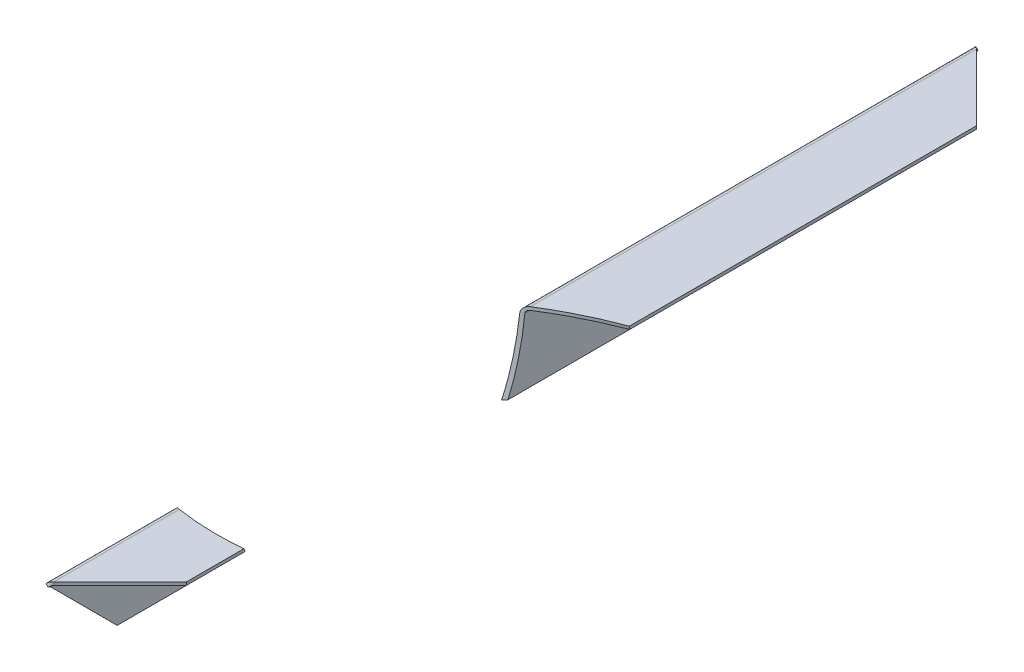
ISO-10303-21;
HEADER;
FILE_DESCRIPTION(('STEP AP214'),'2;1');
FILE_NAME('part.step','',(''),(''),'','','');
FILE_SCHEMA(('AUTOMOTIVE_DESIGN { 1 0 10303 214 1 1 1 1 }'));
ENDSEC;
DATA;
#1=APPLICATION_CONTEXT('core data for automotive mechanical design processes');
#2=APPLICATION_PROTOCOL_DEFINITION('international standard','automotive_design',2000,#1);
#3=PRODUCT_CONTEXT('',#1,'mechanical');
#4=PRODUCT('Part','Part','',(#3));
#5=PRODUCT_RELATED_PRODUCT_CATEGORY('part','',(#4));
#6=PRODUCT_DEFINITION_FORMATION('','',#4);
#7=PRODUCT_DEFINITION_CONTEXT('part definition',#1,'design');
#8=PRODUCT_DEFINITION('design','',#6,#7);
#9=PRODUCT_DEFINITION_SHAPE('','',#8);
#10=(LENGTH_UNIT() NAMED_UNIT(*) SI_UNIT(.MILLI.,.METRE.));
#11=(NAMED_UNIT(*) PLANE_ANGLE_UNIT() SI_UNIT($,.RADIAN.));
#12=(NAMED_UNIT(*) SI_UNIT($,.STERADIAN.) SOLID_ANGLE_UNIT());
#13=UNCERTAINTY_MEASURE_WITH_UNIT(LENGTH_MEASURE(1.E-05),#10,'distance_accuracy_value','');
#14=(GEOMETRIC_REPRESENTATION_CONTEXT(3) GLOBAL_UNCERTAINTY_ASSIGNED_CONTEXT((#13)) GLOBAL_UNIT_ASSIGNED_CONTEXT((#10,
#11,#12)) REPRESENTATION_CONTEXT('',''));
#15=CARTESIAN_POINT('',(0.,0.,0.));
#16=DIRECTION('',(0.,0.,1.));
#17=DIRECTION('',(1.,0.,0.));
#18=AXIS2_PLACEMENT_3D('',#15,#16,#17);
#19=CARTESIAN_POINT('',(-112.900713999999,0.188336430717542,0.));
#20=DIRECTION('',(-1.,0.,0.));
#21=DIRECTION('',(0.,0.,1.));
#22=AXIS2_PLACEMENT_3D('',#19,#20,#21);
#23=PLANE('',#22);
#24=CARTESIAN_POINT('',(-112.900714,144.464444628672,47.4402808210171));
#25=DIRECTION('',(-1.,0.,0.));
#26=DIRECTION('',(0.,0.905298236340612,0.424776533342623));
#27=AXIS2_PLACEMENT_3D('',#24,#25,#26);
#28=ELLIPSE('',#27,71.8757346714846,44.45);
#29=CARTESIAN_POINT('',(-112.900714,111.427514,-2.55808912747782));
#30=VERTEX_POINT('',#29);
#31=CARTESIAN_POINT('',(-112.900714,95.4360504307374,1.79167078233812));
#32=VERTEX_POINT('',#31);
#33=EDGE_CURVE('E12',#30,#32,#28,.T.);
#34=ORIENTED_EDGE('',*,*,#33,.F.);
#35=DIRECTION('',(0.,0.,-1.));
#36=VECTOR('',#35,1.);
#37=CARTESIAN_POINT('',(-112.900714,111.427514,0.));
#38=LINE('',#37,#36);
#39=CARTESIAN_POINT('',(-112.900714,111.427514,-111.239177569261));
#40=VERTEX_POINT('',#39);
#41=EDGE_CURVE('E192',#30,#40,#38,.T.);
#42=ORIENTED_EDGE('',*,*,#41,.T.);
#43=DIRECTION('',(0.,0.707106781186616,-0.70710678118648));
#44=VECTOR('',#43,1.);
#45=CARTESIAN_POINT('',(-112.900714,112.295300430737,-112.106963999998));
#46=LINE('',#45,#44);
#47=CARTESIAN_POINT('',(-112.900714,95.4360504307374,-95.2477140000015));
#48=VERTEX_POINT('',#47);
#49=EDGE_CURVE('E305',#48,#40,#46,.T.);
#50=ORIENTED_EDGE('',*,*,#49,.F.);
#51=DIRECTION('',(0.,0.,-1.));
#52=VECTOR('',#51,1.);
#53=CARTESIAN_POINT('',(-112.900714,95.4360504307374,95.2477140000016));
#54=LINE('',#53,#52);
#55=EDGE_CURVE('E321',#32,#48,#54,.T.);
#56=ORIENTED_EDGE('',*,*,#55,.F.);
#57=EDGE_LOOP('',(#34,#42,#50,#56));
#58=FACE_BOUND('',#57,.T.);
#59=ADVANCED_FACE('F42',(#58),#23,.T.);
#60=CARTESIAN_POINT('',(-112.164113999999,0.188336430717542,0.));
#61=DIRECTION('',(-1.,0.,0.));
#62=DIRECTION('',(0.,0.,1.));
#63=AXIS2_PLACEMENT_3D('',#60,#61,#62);
#64=PLANE('',#63);
#65=DIRECTION('',(0.,0.,-1.));
#66=VECTOR('',#65,1.);
#67=CARTESIAN_POINT('',(-112.164114,111.427514,0.));
#68=LINE('',#67,#66);
#69=CARTESIAN_POINT('',(-112.164114,111.427514,-3.05309485837146));
#70=VERTEX_POINT('',#69);
#71=CARTESIAN_POINT('',(-112.164114,111.427514,-111.239177569261));
#72=VERTEX_POINT('',#71);
#73=EDGE_CURVE('E142',#70,#72,#68,.T.);
#74=ORIENTED_EDGE('',*,*,#73,.F.);
#75=CARTESIAN_POINT('',(-112.164114,143.617083259913,47.0426889443722));
#76=DIRECTION('',(-1.,0.,0.));
#77=DIRECTION('',(0.,0.905298236340612,0.424776533342623));
#78=AXIS2_PLACEMENT_3D('',#75,#76,#77);
#79=ELLIPSE('',#78,71.8757346714846,44.45);
#80=CARTESIAN_POINT('',(-112.164114,95.4360504307374,1.01322374201379));
#81=VERTEX_POINT('',#80);
#82=EDGE_CURVE('E62',#70,#81,#79,.T.);
#83=ORIENTED_EDGE('',*,*,#82,.T.);
#84=DIRECTION('',(0.,0.,-1.));
#85=VECTOR('',#84,1.);
#86=CARTESIAN_POINT('',(-112.164114,95.4360504307374,95.2477140000016));
#87=LINE('',#86,#85);
#88=CARTESIAN_POINT('',(-112.164114,95.4360504307374,-95.2477140000015));
#89=VERTEX_POINT('',#88);
#90=EDGE_CURVE('E310',#81,#89,#87,.T.);
#91=ORIENTED_EDGE('',*,*,#90,.T.);
#92=DIRECTION('',(0.,0.707106781186616,-0.70710678118648));
#93=VECTOR('',#92,1.);
#94=CARTESIAN_POINT('',(-112.164114,112.295300430737,-112.106963999998));
#95=LINE('',#94,#93);
#96=EDGE_CURVE('E303',#89,#72,#95,.T.);
#97=ORIENTED_EDGE('',*,*,#96,.T.);
#98=EDGE_LOOP('',(#74,#83,#91,#97));
#99=FACE_BOUND('',#98,.T.);
#100=ADVANCED_FACE('F308',(#99),#64,.F.);
#101=CARTESIAN_POINT('',(-95.436050430738,112.164114,95.2477140000016));
#102=DIRECTION('',(-1.,0.,0.));
#103=DIRECTION('',(0.,0.,-1.));
#104=AXIS2_PLACEMENT_3D('',#101,#102,#103);
#105=PLANE('',#104);
#106=DIRECTION('',(0.,0.,1.));
#107=VECTOR('',#106,1.);
#108=CARTESIAN_POINT('',(-95.436050430738,112.900714,95.2477140000016));
#109=LINE('',#108,#107);
#110=CARTESIAN_POINT('',(-95.436050430738,112.900714,-95.2477140000015));
#111=VERTEX_POINT('',#110);
#112=CARTESIAN_POINT('',(-95.436050430738,112.900714,-11.526520226869));
#113=VERTEX_POINT('',#112);
#114=EDGE_CURVE('E208',#111,#113,#109,.T.);
#115=ORIENTED_EDGE('',*,*,#114,.T.);
#116=CARTESIAN_POINT('',(-95.4360504307381,124.373647415849,38.013443509758));
#117=DIRECTION('',(-1.,0.,0.));
#118=DIRECTION('',(0.,0.905298236340612,0.424776533342624));
#119=AXIS2_PLACEMENT_3D('',#116,#117,#118);
#120=ELLIPSE('',#119,71.8757346714843,44.45);
#121=CARTESIAN_POINT('',(-95.436050430738,112.164114,-11.6323819747816));
#122=VERTEX_POINT('',#121);
#123=EDGE_CURVE('E81',#113,#122,#120,.T.);
#124=ORIENTED_EDGE('',*,*,#123,.T.);
#125=DIRECTION('',(0.,0.,1.));
#126=VECTOR('',#125,1.);
#127=CARTESIAN_POINT('',(-95.436050430738,112.164114,95.2477140000016));
#128=LINE('',#127,#126);
#129=CARTESIAN_POINT('',(-95.436050430738,112.164114,-95.2477140000015));
#130=VERTEX_POINT('',#129);
#131=EDGE_CURVE('E327',#130,#122,#128,.T.);
#132=ORIENTED_EDGE('',*,*,#131,.F.);
#133=DIRECTION('',(0.,1.,0.));
#134=VECTOR('',#133,1.);
#135=CARTESIAN_POINT('',(-95.436050430738,112.164114,-95.2477140000015));
#136=LINE('',#135,#134);
#137=EDGE_CURVE('E225',#130,#111,#136,.T.);
#138=ORIENTED_EDGE('',*,*,#137,.T.);
#139=EDGE_LOOP('',(#115,#124,#132,#138));
#140=FACE_BOUND('',#139,.T.);
#141=ADVANCED_FACE('F334',(#140),#105,.F.);
#142=CARTESIAN_POINT('',(-112.164114,95.4360504307374,95.2477140000016));
#143=DIRECTION('',(0.,1.,0.));
#144=DIRECTION('',(0.,0.,1.));
#145=AXIS2_PLACEMENT_3D('',#142,#143,#144);
#146=PLANE('',#145);
#147=ORIENTED_EDGE('',*,*,#90,.F.);
#148=CARTESIAN_POINT('',(-70.2809811473104,95.4360504307377,24.4355841511802));
#149=DIRECTION('',(0.,1.,0.));
#150=DIRECTION('',(-0.879991354301576,0.,0.474989701314121));
#151=AXIS2_PLACEMENT_3D('',#148,#149,#150);
#152=ELLIPSE('',#151,62.4806229207186,44.45);
#153=EDGE_CURVE('E227',#81,#32,#152,.T.);
#154=ORIENTED_EDGE('',*,*,#153,.T.);
#155=ORIENTED_EDGE('',*,*,#55,.T.);
#156=DIRECTION('',(-1.,0.,0.));
#157=VECTOR('',#156,1.);
#158=CARTESIAN_POINT('',(-112.164114,95.4360504307374,-95.2477140000015));
#159=LINE('',#158,#157);
#160=EDGE_CURVE('E319',#89,#48,#159,.T.);
#161=ORIENTED_EDGE('',*,*,#160,.F.);
#162=EDGE_LOOP('',(#147,#154,#155,#161));
#163=FACE_BOUND('',#162,.T.);
#164=ADVANCED_FACE('F342',(#163),#146,.F.);
#165=CARTESIAN_POINT('',(-112.164114,112.295300430737,-112.106963999998));
#166=DIRECTION('',(0.,0.70710678118648,0.707106781186616));
#167=DIRECTION('',(0.,-0.707106781186616,0.70710678118648));
#168=AXIS2_PLACEMENT_3D('',#165,#166,#167);
#169=PLANE('',#168);
#170=CARTESIAN_POINT('',(-112.164114,111.427514,-111.239177569261));
#171=CARTESIAN_POINT('',(-112.900714,111.427514,-111.239177569261));
#172=B_SPLINE_CURVE_WITH_KNOTS('',1,(#170,#171),.UNSPECIFIED.,.F.,.F.,(2,2),(0.,1.),.UNSPECIFIED.);
#173=EDGE_CURVE('E212',#72,#40,#172,.T.);
#174=ORIENTED_EDGE('',*,*,#173,.F.);
#175=ORIENTED_EDGE('',*,*,#96,.F.);
#176=ORIENTED_EDGE('',*,*,#160,.T.);
#177=ORIENTED_EDGE('',*,*,#49,.T.);
#178=EDGE_LOOP('',(#174,#175,#176,#177));
#179=FACE_BOUND('',#178,.T.);
#180=ADVANCED_FACE('F301',(#179),#169,.F.);
#181=CARTESIAN_POINT('',(-224.402264430758,112.164113999999,0.));
#182=DIRECTION('',(0.,1.,0.));
#183=DIRECTION('',(0.,0.,1.));
#184=AXIS2_PLACEMENT_3D('',#181,#182,#183);
#185=PLANE('',#184);
#186=ORIENTED_EDGE('',*,*,#131,.T.);
#187=CARTESIAN_POINT('',(-84.8224649574166,112.164114,32.2845874599779));
#188=DIRECTION('',(0.,1.,0.));
#189=DIRECTION('',(-0.879991354301577,0.,0.474989701314119));
#190=AXIS2_PLACEMENT_3D('',#187,#188,#189);
#191=ELLIPSE('',#190,62.4806229207188,44.45);
#192=CARTESIAN_POINT('',(-111.427514,112.164114,-3.6039334665327));
#193=VERTEX_POINT('',#192);
#194=EDGE_CURVE('E325',#122,#193,#191,.T.);
#195=ORIENTED_EDGE('',*,*,#194,.T.);
#196=DIRECTION('',(0.,0.,-1.));
#197=VECTOR('',#196,1.);
#198=CARTESIAN_POINT('',(-111.427514,112.164114,0.));
#199=LINE('',#198,#197);
#200=CARTESIAN_POINT('',(-111.427514,112.164114,-111.239177569261));
#201=VERTEX_POINT('',#200);
#202=EDGE_CURVE('E190',#193,#201,#199,.T.);
#203=ORIENTED_EDGE('',*,*,#202,.T.);
#204=DIRECTION('',(0.707106781186614,0.,0.707106781186481));
#205=VECTOR('',#204,1.);
#206=CARTESIAN_POINT('',(-112.295300430738,112.164114,-112.106963999998));
#207=LINE('',#206,#205);
#208=EDGE_CURVE('E216',#201,#130,#207,.T.);
#209=ORIENTED_EDGE('',*,*,#208,.T.);
#210=EDGE_LOOP('',(#186,#195,#203,#209));
#211=FACE_BOUND('',#210,.T.);
#212=ADVANCED_FACE('F335',(#211),#185,.F.);
#213=CARTESIAN_POINT('',(-112.295300430738,112.164114,-112.106963999998));
#214=DIRECTION('',(-0.707106781186481,0.,0.707106781186614));
#215=DIRECTION('',(-0.707106781186614,0.,-0.707106781186481));
#216=AXIS2_PLACEMENT_3D('',#213,#214,#215);
#217=PLANE('',#216);
#218=ORIENTED_EDGE('',*,*,#208,.F.);
#219=CARTESIAN_POINT('',(-111.427514,112.900714,-111.239177569261));
#220=CARTESIAN_POINT('',(-111.427514,112.164114,-111.239177569261));
#221=B_SPLINE_CURVE_WITH_KNOTS('',1,(#219,#220),.UNSPECIFIED.,.F.,.F.,(2,2),(0.,1.),.UNSPECIFIED.);
#222=CARTESIAN_POINT('',(-111.427514,112.900714,-111.239177569261));
#223=VERTEX_POINT('',#222);
#224=EDGE_CURVE('E151',#201,#223,#221,.F.);
#225=ORIENTED_EDGE('',*,*,#224,.T.);
#226=DIRECTION('',(0.707106781186614,0.,0.707106781186481));
#227=VECTOR('',#226,1.);
#228=CARTESIAN_POINT('',(-112.295300430738,112.900714,-112.106963999998));
#229=LINE('',#228,#227);
#230=EDGE_CURVE('E206',#223,#111,#229,.T.);
#231=ORIENTED_EDGE('',*,*,#230,.T.);
#232=ORIENTED_EDGE('',*,*,#137,.F.);
#233=EDGE_LOOP('',(#218,#225,#231,#232));
#234=FACE_BOUND('',#233,.T.);
#235=ADVANCED_FACE('F215',(#234),#217,.F.);
#236=CARTESIAN_POINT('',(-224.402264430758,112.900713999999,0.));
#237=DIRECTION('',(0.,1.,0.));
#238=DIRECTION('',(0.,0.,1.));
#239=AXIS2_PLACEMENT_3D('',#236,#237,#238);
#240=PLANE('',#239);
#241=CARTESIAN_POINT('',(-85.4627815684921,112.900714,32.6302088054087));
#242=DIRECTION('',(0.,1.,0.));
#243=DIRECTION('',(-0.879991354301577,0.,0.474989701314119));
#244=AXIS2_PLACEMENT_3D('',#241,#242,#243);
#245=ELLIPSE('',#244,62.4806229207188,44.45);
#246=CARTESIAN_POINT('',(-111.427514,112.900714,-3.66274396001641));
#247=VERTEX_POINT('',#246);
#248=EDGE_CURVE('E53',#113,#247,#245,.T.);
#249=ORIENTED_EDGE('',*,*,#248,.F.);
#250=ORIENTED_EDGE('',*,*,#114,.F.);
#251=ORIENTED_EDGE('',*,*,#230,.F.);
#252=DIRECTION('',(0.,0.,-1.));
#253=VECTOR('',#252,1.);
#254=CARTESIAN_POINT('',(-111.427514,112.900714,0.));
#255=LINE('',#254,#253);
#256=EDGE_CURVE('E189',#247,#223,#255,.T.);
#257=ORIENTED_EDGE('',*,*,#256,.F.);
#258=EDGE_LOOP('',(#249,#250,#251,#257));
#259=FACE_BOUND('',#258,.T.);
#260=ADVANCED_FACE('F178',(#259),#240,.T.);
#261=CARTESIAN_POINT('',(-112.900714,111.427514,-111.239177569261));
#262=CARTESIAN_POINT('',(-112.900714,111.620377681075,-111.383825330067));
#263=CARTESIAN_POINT('',(-112.862370547268,111.813120983238,-111.52843971284));
#264=CARTESIAN_POINT('',(-112.714776107324,112.169445481882,-111.817701856419));
#265=CARTESIAN_POINT('',(-112.605598926777,112.332848493311,-111.962316239192));
#266=CARTESIAN_POINT('',(-112.469223710044,112.469223710044,-112.106963999998));
#267=CARTESIAN_POINT('',(-112.164114,111.427514,-111.239177569261));
#268=CARTESIAN_POINT('',(-112.164114,111.52394006357,-111.383816664616));
#269=CARTESIAN_POINT('',(-112.144942273634,111.620317491619,-111.52843971284));
#270=CARTESIAN_POINT('',(-112.071145053662,111.798479740941,-111.817701856419));
#271=CARTESIAN_POINT('',(-112.016552378456,111.880185331588,-111.962324904643));
#272=CARTESIAN_POINT('',(-111.948368855022,111.948368855022,-112.106963999998));
#273=B_SPLINE_SURFACE_WITH_KNOTS('',1,3,((#261,#262,#263,#264,#265,#266),(#267,#268,#269,#270,
#271,#272)),.UNSPECIFIED.,.F.,.F.,.F.,(2,2),(4,2,4),(0.,1.),(0.,0.5,1.),.UNSPECIFIED.);
#274=CARTESIAN_POINT('',(-112.900714,111.427514,-111.239177569261));
#275=CARTESIAN_POINT('',(-112.900714,111.620377681075,-111.383825330067));
#276=CARTESIAN_POINT('',(-112.862370547268,111.813120983238,-111.52843971284));
#277=CARTESIAN_POINT('',(-112.714776107324,112.169445481882,-111.817701856419));
#278=CARTESIAN_POINT('',(-112.605598926777,112.332848493311,-111.962316239192));
#279=CARTESIAN_POINT('',(-112.469223710044,112.469223710044,-112.106963999998));
#280=B_SPLINE_CURVE_WITH_KNOTS('',3,(#274,#275,#276,#277,#278,#279),.UNSPECIFIED.,.F.,.F.,(4,2,
4),(0.,0.5,1.),.UNSPECIFIED.);
#281=CARTESIAN_POINT('',(-112.469223945747,112.469223474341,-112.106963749998));
#282=VERTEX_POINT('',#281);
#283=EDGE_CURVE('E122',#40,#282,#280,.T.);
#284=CARTESIAN_POINT('',(-112.469223710044,112.469223710044,-112.106963999998));
#285=CARTESIAN_POINT('',(-111.948368855022,111.948368855022,-112.106963999998));
#286=B_SPLINE_CURVE_WITH_KNOTS('',1,(#284,#285),.UNSPECIFIED.,.F.,.F.,(2,2),(0.,1.),.UNSPECIFIED.);
#287=CARTESIAN_POINT('',(-111.948368855022,111.948368855022,-112.106963999998));
#288=VERTEX_POINT('',#287);
#289=EDGE_CURVE('E114',#282,#288,#286,.T.);
#290=CARTESIAN_POINT('',(-111.948368855022,111.948368855022,-112.106963999998));
#291=CARTESIAN_POINT('',(-112.016552378456,111.880185331588,-111.962324904643));
#292=CARTESIAN_POINT('',(-112.071145053662,111.798479740941,-111.817701856419));
#293=CARTESIAN_POINT('',(-112.144942273634,111.620317491619,-111.52843971284));
#294=CARTESIAN_POINT('',(-112.164114,111.52394006357,-111.383816664616));
#295=CARTESIAN_POINT('',(-112.164114,111.427514,-111.239177569261));
#296=B_SPLINE_CURVE_WITH_KNOTS('',3,(#290,#291,#292,#293,#294,#295),.UNSPECIFIED.,.F.,.F.,(4,2,
4),(0.,0.5,1.),.UNSPECIFIED.);
#297=EDGE_CURVE('E119',#72,#288,#296,.F.);
#298=ORIENTED_EDGE('',*,*,#173,.T.);
#299=ORIENTED_EDGE('',*,*,#283,.T.);
#300=ORIENTED_EDGE('',*,*,#289,.T.);
#301=ORIENTED_EDGE('',*,*,#297,.F.);
#302=EDGE_LOOP('',(#298,#299,#300,#301));
#303=FACE_BOUND('',#302,.T.);
#304=ADVANCED_FACE('F118',(#303),#273,.F.);
#305=CARTESIAN_POINT('',(-112.469223710044,112.469223710044,-112.106963999998));
#306=CARTESIAN_POINT('',(-112.332848493311,112.605598926776,-111.962316239192));
#307=CARTESIAN_POINT('',(-112.169445481883,112.714776107323,-111.817701856419));
#308=CARTESIAN_POINT('',(-111.813120983238,112.862370547267,-111.52843971284));
#309=CARTESIAN_POINT('',(-111.620377681075,112.900714,-111.383825330067));
#310=CARTESIAN_POINT('',(-111.427514,112.900714,-111.239177569261));
#311=CARTESIAN_POINT('',(-111.948368855022,111.948368855022,-112.106963999998));
#312=CARTESIAN_POINT('',(-111.880185331589,112.016552378455,-111.962324904643));
#313=CARTESIAN_POINT('',(-111.798479740941,112.071145053661,-111.817701856419));
#314=CARTESIAN_POINT('',(-111.620317491619,112.144942273634,-111.52843971284));
#315=CARTESIAN_POINT('',(-111.52394006357,112.164114,-111.383816664616));
#316=CARTESIAN_POINT('',(-111.427514,112.164114,-111.239177569261));
#317=B_SPLINE_SURFACE_WITH_KNOTS('',1,3,((#305,#306,#307,#308,#309,#310),(#311,#312,#313,#314,
#315,#316)),.UNSPECIFIED.,.F.,.F.,.F.,(2,2),(4,2,4),(0.,1.),(0.,0.5,1.),.UNSPECIFIED.);
#318=CARTESIAN_POINT('',(-112.469223710044,112.469223710044,-112.106963999998));
#319=CARTESIAN_POINT('',(-112.332848493311,112.605598926776,-111.962316239192));
#320=CARTESIAN_POINT('',(-112.169445481883,112.714776107323,-111.817701856419));
#321=CARTESIAN_POINT('',(-111.813120983238,112.862370547267,-111.52843971284));
#322=CARTESIAN_POINT('',(-111.620377681075,112.900714,-111.383825330067));
#323=CARTESIAN_POINT('',(-111.427514,112.900714,-111.239177569261));
#324=B_SPLINE_CURVE_WITH_KNOTS('',3,(#318,#319,#320,#321,#322,#323),.UNSPECIFIED.,.F.,.F.,(4,2,
4),(0.,0.5,1.),.UNSPECIFIED.);
#325=EDGE_CURVE('E129',#282,#223,#324,.T.);
#326=CARTESIAN_POINT('',(-111.427514,112.164114,-111.239177569261));
#327=CARTESIAN_POINT('',(-111.52394006357,112.164114,-111.383816664616));
#328=CARTESIAN_POINT('',(-111.620317491619,112.144942273634,-111.52843971284));
#329=CARTESIAN_POINT('',(-111.798479740941,112.071145053661,-111.817701856419));
#330=CARTESIAN_POINT('',(-111.880185331589,112.016552378455,-111.962324904643));
#331=CARTESIAN_POINT('',(-111.948368855022,111.948368855022,-112.106963999998));
#332=B_SPLINE_CURVE_WITH_KNOTS('',3,(#326,#327,#328,#329,#330,#331),.UNSPECIFIED.,.F.,.F.,(4,2,
4),(0.,0.5,1.),.UNSPECIFIED.);
#333=EDGE_CURVE('E138',#288,#201,#332,.F.);
#334=ORIENTED_EDGE('',*,*,#289,.F.);
#335=ORIENTED_EDGE('',*,*,#325,.T.);
#336=ORIENTED_EDGE('',*,*,#224,.F.);
#337=ORIENTED_EDGE('',*,*,#333,.F.);
#338=EDGE_LOOP('',(#334,#335,#336,#337));
#339=FACE_BOUND('',#338,.T.);
#340=ADVANCED_FACE('F149',(#339),#317,.F.);
#341=CARTESIAN_POINT('',(-111.427514,111.427514,224.221855094246));
#342=DIRECTION('',(0.,0.,-1.));
#343=DIRECTION('',(1.,0.,0.));
#344=AXIS2_PLACEMENT_3D('',#341,#342,#343);
#345=CYLINDRICAL_SURFACE('',#344,0.7366);
#346=CARTESIAN_POINT('',(-112.164114,111.427514,-3.05309485837146));
#347=CARTESIAN_POINT('',(-112.164157163943,111.46615399432,-3.05726131597747));
#348=CARTESIAN_POINT('',(-112.161078319071,111.504480568388,-3.06343159659667));
#349=CARTESIAN_POINT('',(-112.149284220798,111.579282870643,-3.07922088784986));
#350=CARTESIAN_POINT('',(-112.140604035533,111.615768601782,-3.08881827665532));
#351=CARTESIAN_POINT('',(-112.11823077241,111.686075533842,-3.11093791076271));
#352=CARTESIAN_POINT('',(-112.104551039999,111.719903539706,-3.12345233760647));
#353=CARTESIAN_POINT('',(-112.072860252808,111.784447699176,-3.15089587271296));
#354=CARTESIAN_POINT('',(-112.054842559334,111.815158979627,-3.16582867040582));
#355=CARTESIAN_POINT('',(-112.01318060832,111.875915284473,-3.19919204297923));
#356=CARTESIAN_POINT('',(-111.989153894601,111.905586648832,-3.21782306171457));
#357=CARTESIAN_POINT('',(-111.937538097662,111.960309556414,-3.25681181263638));
#358=CARTESIAN_POINT('',(-111.909948151787,111.985359977331,-3.27716996254955));
#359=CARTESIAN_POINT('',(-111.847136561527,112.034420701319,-3.32260153175712));
#360=CARTESIAN_POINT('',(-111.811407223087,112.05757487131,-3.34789817731997));
#361=CARTESIAN_POINT('',(-111.737105259248,112.09722138294,-3.39954068000107));
#362=CARTESIAN_POINT('',(-111.698530594322,112.113708889957,-3.425887283386));
#363=CARTESIAN_POINT('',(-111.621619217966,112.139169267375,-3.47760378942116));
#364=CARTESIAN_POINT('',(-111.583384235425,112.148502887728,-3.50294860846922));
#365=CARTESIAN_POINT('',(-111.505984970538,112.160967428298,-3.55358005597734));
#366=CARTESIAN_POINT('',(-111.466822603111,112.164110164334,-3.57886670310399));
#367=CARTESIAN_POINT('',(-111.427514,112.164114,-3.60393346653268));
#368=B_SPLINE_CURVE_WITH_KNOTS('',3,(#346,#347,#348,#349,#350,#351,#352,#353,#354,#355,#356,
#357,#358,#359,#360,#361,#362,#363,#364,#365,#366,#367),.UNSPECIFIED.,.F.,.F.,(4,2,2,2,2,2,2,2,
2,2,4),(0.,0.116275515910285,0.231830040607708,0.34707833840635,0.462504142832921,
0.589471198934855,0.716469051519436,0.864455856575865,1.01254978908397,1.15256808781867,
1.29231889001515),.UNSPECIFIED.);
#369=EDGE_CURVE('E421',#70,#193,#368,.T.);
#370=ORIENTED_EDGE('',*,*,#369,.F.);
#371=ORIENTED_EDGE('',*,*,#73,.T.);
#372=ORIENTED_EDGE('',*,*,#297,.T.);
#373=ORIENTED_EDGE('',*,*,#333,.T.);
#374=ORIENTED_EDGE('',*,*,#202,.F.);
#375=EDGE_LOOP('',(#370,#371,#372,#373,#374));
#376=FACE_BOUND('',#375,.T.);
#377=ADVANCED_FACE('F136',(#376),#345,.F.);
#378=CARTESIAN_POINT('',(-111.427514,111.427514,224.221855094246));
#379=DIRECTION('',(0.,0.,-1.));
#380=DIRECTION('',(1.,0.,0.));
#381=AXIS2_PLACEMENT_3D('',#378,#379,#380);
#382=CYLINDRICAL_SURFACE('',#381,1.4732);
#383=ORIENTED_EDGE('',*,*,#41,.F.);
#384=CARTESIAN_POINT('',(-112.900714,111.427514,-2.55808912747782));
#385=CARTESIAN_POINT('',(-112.900716832962,111.466438100279,-2.56281468395924));
#386=CARTESIAN_POINT('',(-112.899170547739,111.505212872524,-2.56853924770639));
#387=CARTESIAN_POINT('',(-112.893081341033,111.582170005874,-2.58186599173102));
#388=CARTESIAN_POINT('',(-112.88854080412,111.620352813664,-2.58946667488842));
#389=CARTESIAN_POINT('',(-112.870659433627,111.733140933982,-2.61479842347962));
#390=CARTESIAN_POINT('',(-112.85305581406,111.806533953727,-2.63512822847126));
#391=CARTESIAN_POINT('',(-112.807756809908,111.947852465904,-2.68149849715604));
#392=CARTESIAN_POINT('',(-112.780090825779,112.01579319015,-2.70752223680396));
#393=CARTESIAN_POINT('',(-112.715999022109,112.145399152383,-2.76424103761986));
#394=CARTESIAN_POINT('',(-112.679559235215,112.207054158859,-2.79494351815513));
#395=CARTESIAN_POINT('',(-112.595032957118,112.329353738376,-2.86343378426344));
#396=CARTESIAN_POINT('',(-112.546121116582,112.389197601253,-2.90162767371233));
#397=CARTESIAN_POINT('',(-112.440952219231,112.499461547404,-2.98128554293743));
#398=CARTESIAN_POINT('',(-112.384693346078,112.549879292827,-3.02275033034051));
#399=CARTESIAN_POINT('',(-112.256735924808,112.648263804126,-3.11487906180834));
#400=CARTESIAN_POINT('',(-112.184011282748,112.694519347613,-3.16594708943577));
#401=CARTESIAN_POINT('',(-112.032696877545,112.773380655782,-3.26993820810705));
#402=CARTESIAN_POINT('',(-111.954103808001,112.805978656082,-3.32286233587686));
#403=CARTESIAN_POINT('',(-111.801429487656,112.854480039971,-3.42385283550533));
#404=CARTESIAN_POINT('',(-111.727738161663,112.871774641724,-3.47184725515639));
#405=CARTESIAN_POINT('',(-111.578629360926,112.894879300259,-3.56761615650146));
#406=CARTESIAN_POINT('',(-111.503215243876,112.900710041243,-3.61539087886114));
#407=CARTESIAN_POINT('',(-111.427514,112.900714,-3.66274396001641));
#408=B_SPLINE_CURVE_WITH_KNOTS('',3,(#384,#385,#386,#387,#388,#389,#390,#391,#392,#393,#394,
#395,#396,#397,#398,#399,#400,#401,#402,#403,#404,#405,#406,#407),.UNSPECIFIED.,.F.,.F.,(4,2,2,
2,2,2,2,2,2,2,2,4),(0.,0.117536286199059,0.234979081408,0.468231678323866,0.700808156404445,
0.933757358754861,1.19141321082357,1.44913288178019,1.74847951943055,2.04799610696984,
2.31613406128299,2.58378776969684),.UNSPECIFIED.);
#409=EDGE_CURVE('E153',#30,#247,#408,.T.);
#410=ORIENTED_EDGE('',*,*,#409,.T.);
#411=ORIENTED_EDGE('',*,*,#256,.T.);
#412=ORIENTED_EDGE('',*,*,#325,.F.);
#413=ORIENTED_EDGE('',*,*,#283,.F.);
#414=EDGE_LOOP('',(#383,#410,#411,#412,#413));
#415=FACE_BOUND('',#414,.T.);
#416=ADVANCED_FACE('F164',(#415),#382,.T.);
#417=CARTESIAN_POINT('',(-51.7133279190978,74.0764087607668,14.4133901627261));
#418=DIRECTION('',(-0.618428461332099,0.711420564042745,0.333806859233772));
#419=DIRECTION('',(-0.754709580222772,-0.656059028990507,0.));
#420=AXIS2_PLACEMENT_3D('',#417,#418,#419);
#421=CYLINDRICAL_SURFACE('',#420,44.45);
#422=ORIENTED_EDGE('',*,*,#369,.T.);
#423=ORIENTED_EDGE('',*,*,#194,.F.);
#424=ORIENTED_EDGE('',*,*,#123,.F.);
#425=ORIENTED_EDGE('',*,*,#248,.T.);
#426=ORIENTED_EDGE('',*,*,#409,.F.);
#427=ORIENTED_EDGE('',*,*,#33,.T.);
#428=ORIENTED_EDGE('',*,*,#153,.F.);
#429=ORIENTED_EDGE('',*,*,#82,.F.);
#430=EDGE_LOOP('',(#422,#423,#424,#425,#426,#427,#428,#429));
#431=FACE_BOUND('',#430,.T.);
#432=ADVANCED_FACE('F44',(#431),#421,.F.);
#433=CLOSED_SHELL('',(#59,#100,#141,#164,#180,#212,#235,#260,#304,#340,#377,#416,#432));
#434=MANIFOLD_SOLID_BREP('B2',#433);
#435=CARTESIAN_POINT('',(-112.164114,112.295300430737,112.106963999998));
#436=DIRECTION('',(0.,0.70710678118648,-0.707106781186615));
#437=DIRECTION('',(0.,0.707106781186615,0.70710678118648));
#438=AXIS2_PLACEMENT_3D('',#435,#436,#437);
#439=PLANE('',#438);
#440=CARTESIAN_POINT('',(-112.900714,111.427514,111.239177569261));
#441=CARTESIAN_POINT('',(-112.164114,111.427514,111.239177569261));
#442=B_SPLINE_CURVE_WITH_KNOTS('',1,(#440,#441),.UNSPECIFIED.,.F.,.F.,(2,2),(0.,1.),.UNSPECIFIED.);
#443=CARTESIAN_POINT('',(-112.900714,111.427514,111.239177569261));
#444=VERTEX_POINT('',#443);
#445=CARTESIAN_POINT('',(-112.164114,111.427514,111.239177569261));
#446=VERTEX_POINT('',#445);
#447=EDGE_CURVE('E509',#444,#446,#442,.T.);
#448=ORIENTED_EDGE('',*,*,#447,.F.);
#449=DIRECTION('',(0.,-0.707106781186615,-0.70710678118648));
#450=VECTOR('',#449,1.);
#451=CARTESIAN_POINT('',(-112.900714,112.295300430737,112.106963999998));
#452=LINE('',#451,#450);
#453=CARTESIAN_POINT('',(-112.900714,95.4360504307374,95.2477140000016));
#454=VERTEX_POINT('',#453);
#455=EDGE_CURVE('E523',#444,#454,#452,.T.);
#456=ORIENTED_EDGE('',*,*,#455,.T.);
#457=DIRECTION('',(-1.,0.,0.));
#458=VECTOR('',#457,1.);
#459=CARTESIAN_POINT('',(-112.164114,95.4360504307374,95.2477140000016));
#460=LINE('',#459,#458);
#461=CARTESIAN_POINT('',(-112.164114,95.4360504307374,95.2477140000016));
#462=VERTEX_POINT('',#461);
#463=EDGE_CURVE('E800',#462,#454,#460,.T.);
#464=ORIENTED_EDGE('',*,*,#463,.F.);
#465=DIRECTION('',(0.,-0.707106781186615,-0.70710678118648));
#466=VECTOR('',#465,1.);
#467=CARTESIAN_POINT('',(-112.164114,112.295300430737,112.106963999998));
#468=LINE('',#467,#466);
#469=EDGE_CURVE('E655',#446,#462,#468,.T.);
#470=ORIENTED_EDGE('',*,*,#469,.F.);
#471=EDGE_LOOP('',(#448,#456,#464,#470));
#472=FACE_BOUND('',#471,.T.);
#473=ADVANCED_FACE('F496',(#472),#439,.F.);
#474=CARTESIAN_POINT('',(-112.295300430738,112.164114,112.106963999998));
#475=DIRECTION('',(-0.707106781186481,0.,-0.707106781186614));
#476=DIRECTION('',(0.707106781186614,0.,-0.707106781186481));
#477=AXIS2_PLACEMENT_3D('',#474,#475,#476);
#478=PLANE('',#477);
#479=DIRECTION('',(-0.707106781186614,0.,0.707106781186481));
#480=VECTOR('',#479,1.);
#481=CARTESIAN_POINT('',(-112.295300430738,112.900714,112.106963999998));
#482=LINE('',#481,#480);
#483=CARTESIAN_POINT('',(-95.436050430738,112.900714,95.2477140000016));
#484=VERTEX_POINT('',#483);
#485=CARTESIAN_POINT('',(-111.427514,112.900714,111.239177569261));
#486=VERTEX_POINT('',#485);
#487=EDGE_CURVE('E620',#484,#486,#482,.T.);
#488=ORIENTED_EDGE('',*,*,#487,.T.);
#489=CARTESIAN_POINT('',(-111.427514,112.164114,111.239177569261));
#490=CARTESIAN_POINT('',(-111.427514,112.900714,111.239177569261));
#491=B_SPLINE_CURVE_WITH_KNOTS('',1,(#489,#490),.UNSPECIFIED.,.F.,.F.,(2,2),(0.,1.),.UNSPECIFIED.);
#492=CARTESIAN_POINT('',(-111.427514,112.164114,111.239177569261));
#493=VERTEX_POINT('',#492);
#494=EDGE_CURVE('E615',#486,#493,#491,.F.);
#495=ORIENTED_EDGE('',*,*,#494,.T.);
#496=DIRECTION('',(-0.707106781186614,0.,0.707106781186481));
#497=VECTOR('',#496,1.);
#498=CARTESIAN_POINT('',(-112.295300430738,112.164114,112.106963999998));
#499=LINE('',#498,#497);
#500=CARTESIAN_POINT('',(-95.436050430738,112.164114,95.2477140000016));
#501=VERTEX_POINT('',#500);
#502=EDGE_CURVE('E594',#501,#493,#499,.T.);
#503=ORIENTED_EDGE('',*,*,#502,.F.);
#504=DIRECTION('',(0.,1.,0.));
#505=VECTOR('',#504,1.);
#506=CARTESIAN_POINT('',(-95.436050430738,112.164114,95.2477140000016));
#507=LINE('',#506,#505);
#508=EDGE_CURVE('E740',#501,#484,#507,.T.);
#509=ORIENTED_EDGE('',*,*,#508,.T.);
#510=EDGE_LOOP('',(#488,#495,#503,#509));
#511=FACE_BOUND('',#510,.T.);
#512=ADVANCED_FACE('F622',(#511),#478,.F.);
#513=CARTESIAN_POINT('',(-111.427514,112.900714,111.239177569261));
#514=CARTESIAN_POINT('',(-111.620377681075,112.900714,111.383825330067));
#515=CARTESIAN_POINT('',(-111.813120983238,112.862370547267,111.52843971284));
#516=CARTESIAN_POINT('',(-112.169445481883,112.714776107323,111.817701856419));
#517=CARTESIAN_POINT('',(-112.332848493311,112.605598926776,111.962316239192));
#518=CARTESIAN_POINT('',(-112.469223710044,112.469223710044,112.106963999998));
#519=CARTESIAN_POINT('',(-111.427514,112.164114,111.239177569261));
#520=CARTESIAN_POINT('',(-111.52394006357,112.164114,111.383816664616));
#521=CARTESIAN_POINT('',(-111.620317491619,112.144942273633,111.52843971284));
#522=CARTESIAN_POINT('',(-111.798479740941,112.071145053661,111.817701856419));
#523=CARTESIAN_POINT('',(-111.880185331589,112.016552378455,111.962324904643));
#524=CARTESIAN_POINT('',(-111.948368855022,111.948368855022,112.106963999998));
#525=B_SPLINE_SURFACE_WITH_KNOTS('',1,3,((#513,#514,#515,#516,#517,#518),(#519,#520,#521,#522,
#523,#524)),.UNSPECIFIED.,.F.,.F.,.F.,(2,2),(4,2,4),(0.,1.),(0.,0.5,1.),.UNSPECIFIED.);
#526=CARTESIAN_POINT('',(-111.427514,112.900714,111.239177569261));
#527=CARTESIAN_POINT('',(-111.620377681075,112.900714,111.383825330067));
#528=CARTESIAN_POINT('',(-111.813120983238,112.862370547267,111.52843971284));
#529=CARTESIAN_POINT('',(-112.169445481883,112.714776107323,111.817701856419));
#530=CARTESIAN_POINT('',(-112.332848493311,112.605598926776,111.962316239192));
#531=CARTESIAN_POINT('',(-112.469223710044,112.469223710044,112.106963999998));
#532=B_SPLINE_CURVE_WITH_KNOTS('',3,(#526,#527,#528,#529,#530,#531),.UNSPECIFIED.,.F.,.F.,(4,2,
4),(0.,0.5,1.),.UNSPECIFIED.);
#533=CARTESIAN_POINT('',(-112.469223945747,112.469223474341,112.106963749998));
#534=VERTEX_POINT('',#533);
#535=EDGE_CURVE('E589',#486,#534,#532,.T.);
#536=CARTESIAN_POINT('',(-112.469223710044,112.469223710044,112.106963999998));
#537=CARTESIAN_POINT('',(-111.948368855022,111.948368855022,112.106963999998));
#538=B_SPLINE_CURVE_WITH_KNOTS('',1,(#536,#537),.UNSPECIFIED.,.F.,.F.,(2,2),(0.,1.),.UNSPECIFIED.);
#539=CARTESIAN_POINT('',(-111.948368855022,111.948368855022,112.106963999998));
#540=VERTEX_POINT('',#539);
#541=EDGE_CURVE('E592',#534,#540,#538,.T.);
#542=CARTESIAN_POINT('',(-111.948368855022,111.948368855022,112.106963999998));
#543=CARTESIAN_POINT('',(-111.880185331589,112.016552378455,111.962324904643));
#544=CARTESIAN_POINT('',(-111.798479740941,112.071145053661,111.817701856419));
#545=CARTESIAN_POINT('',(-111.620317491619,112.144942273633,111.52843971284));
#546=CARTESIAN_POINT('',(-111.52394006357,112.164114,111.383816664616));
#547=CARTESIAN_POINT('',(-111.427514,112.164114,111.239177569261));
#548=B_SPLINE_CURVE_WITH_KNOTS('',3,(#542,#543,#544,#545,#546,#547),.UNSPECIFIED.,.F.,.F.,(4,2,
4),(0.,0.5,1.),.UNSPECIFIED.);
#549=EDGE_CURVE('E596',#493,#540,#548,.F.);
#550=ORIENTED_EDGE('',*,*,#535,.T.);
#551=ORIENTED_EDGE('',*,*,#541,.T.);
#552=ORIENTED_EDGE('',*,*,#549,.F.);
#553=ORIENTED_EDGE('',*,*,#494,.F.);
#554=EDGE_LOOP('',(#550,#551,#552,#553));
#555=FACE_BOUND('',#554,.T.);
#556=ADVANCED_FACE('F632',(#555),#525,.F.);
#557=CARTESIAN_POINT('',(-112.469223710044,112.469223710044,112.106963999998));
#558=CARTESIAN_POINT('',(-112.605598926777,112.332848493311,111.962316239192));
#559=CARTESIAN_POINT('',(-112.714776107324,112.169445481882,111.817701856419));
#560=CARTESIAN_POINT('',(-112.862370547268,111.813120983238,111.52843971284));
#561=CARTESIAN_POINT('',(-112.900714,111.620377681075,111.383825330067));
#562=CARTESIAN_POINT('',(-112.900714,111.427514,111.239177569261));
#563=CARTESIAN_POINT('',(-111.948368855022,111.948368855022,112.106963999998));
#564=CARTESIAN_POINT('',(-112.016552378456,111.880185331588,111.962324904643));
#565=CARTESIAN_POINT('',(-112.071145053662,111.798479740941,111.817701856419));
#566=CARTESIAN_POINT('',(-112.144942273634,111.620317491619,111.52843971284));
#567=CARTESIAN_POINT('',(-112.164114,111.52394006357,111.383816664616));
#568=CARTESIAN_POINT('',(-112.164114,111.427514,111.239177569261));
#569=B_SPLINE_SURFACE_WITH_KNOTS('',1,3,((#557,#558,#559,#560,#561,#562),(#563,#564,#565,#566,
#567,#568)),.UNSPECIFIED.,.F.,.F.,.F.,(2,2),(4,2,4),(0.,1.),(0.,0.5,1.),.UNSPECIFIED.);
#570=CARTESIAN_POINT('',(-112.469223710044,112.469223710044,112.106963999998));
#571=CARTESIAN_POINT('',(-112.605598926777,112.332848493311,111.962316239192));
#572=CARTESIAN_POINT('',(-112.714776107324,112.169445481882,111.817701856419));
#573=CARTESIAN_POINT('',(-112.862370547268,111.813120983238,111.52843971284));
#574=CARTESIAN_POINT('',(-112.900714,111.620377681075,111.383825330067));
#575=CARTESIAN_POINT('',(-112.900714,111.427514,111.239177569261));
#576=B_SPLINE_CURVE_WITH_KNOTS('',3,(#570,#571,#572,#573,#574,#575),.UNSPECIFIED.,.F.,.F.,(4,2,
4),(0.,0.5,1.),.UNSPECIFIED.);
#577=EDGE_CURVE('E664',#534,#444,#576,.T.);
#578=CARTESIAN_POINT('',(-112.164114,111.427514,111.239177569261));
#579=CARTESIAN_POINT('',(-112.164114,111.52394006357,111.383816664616));
#580=CARTESIAN_POINT('',(-112.144942273634,111.620317491619,111.52843971284));
#581=CARTESIAN_POINT('',(-112.071145053662,111.798479740941,111.817701856419));
#582=CARTESIAN_POINT('',(-112.016552378456,111.880185331588,111.962324904643));
#583=CARTESIAN_POINT('',(-111.948368855022,111.948368855022,112.106963999998));
#584=B_SPLINE_CURVE_WITH_KNOTS('',3,(#578,#579,#580,#581,#582,#583),.UNSPECIFIED.,.F.,.F.,(4,2,
4),(0.,0.5,1.),.UNSPECIFIED.);
#585=EDGE_CURVE('E794',#540,#446,#584,.F.);
#586=ORIENTED_EDGE('',*,*,#541,.F.);
#587=ORIENTED_EDGE('',*,*,#577,.T.);
#588=ORIENTED_EDGE('',*,*,#447,.T.);
#589=ORIENTED_EDGE('',*,*,#585,.F.);
#590=EDGE_LOOP('',(#586,#587,#588,#589));
#591=FACE_BOUND('',#590,.T.);
#592=ADVANCED_FACE('F669',(#591),#569,.F.);
#593=CARTESIAN_POINT('',(-111.427514,111.427514,224.221855094246));
#594=DIRECTION('',(0.,0.,-1.));
#595=DIRECTION('',(1.,0.,0.));
#596=AXIS2_PLACEMENT_3D('',#593,#594,#595);
#597=CYLINDRICAL_SURFACE('',#596,1.4732);
#598=DIRECTION('',(0.,0.,-1.));
#599=VECTOR('',#598,1.);
#600=CARTESIAN_POINT('',(-111.427514,112.900714,0.));
#601=LINE('',#600,#599);
#602=CARTESIAN_POINT('',(-111.427514,112.900714,80.9875543740766));
#603=VERTEX_POINT('',#602);
#604=EDGE_CURVE('E581',#486,#603,#601,.T.);
#605=ORIENTED_EDGE('',*,*,#604,.T.);
#606=CARTESIAN_POINT('',(-111.427514,112.900714,80.9875543740766));
#607=CARTESIAN_POINT('',(-111.467015849066,112.900716760504,80.9811999990045));
#608=CARTESIAN_POINT('',(-111.506330464286,112.899124431035,80.9738595892195));
#609=CARTESIAN_POINT('',(-111.584286512517,112.892869826231,80.9573143982785));
#610=CARTESIAN_POINT('',(-111.622928458774,112.888210007177,80.9481111128927));
#611=CARTESIAN_POINT('',(-111.736949595347,112.869892640422,80.917993918494));
#612=CARTESIAN_POINT('',(-111.81099272273,112.851893548408,80.8944793354832));
#613=CARTESIAN_POINT('',(-111.953268500222,112.805734649151,80.8416843214976));
#614=CARTESIAN_POINT('',(-112.021517500917,112.777604693894,80.812420944102));
#615=CARTESIAN_POINT('',(-112.151440091908,112.712633841723,80.749127573678));
#616=CARTESIAN_POINT('',(-112.213102874917,112.675778937336,80.7150899520222));
#617=CARTESIAN_POINT('',(-112.33556210158,112.590251054298,80.6392546267455));
#618=CARTESIAN_POINT('',(-112.395477921528,112.540714333362,80.597014684847));
#619=CARTESIAN_POINT('',(-112.505622021068,112.434422760567,80.5091823923485));
#620=CARTESIAN_POINT('',(-112.55584673665,112.377665265872,80.4635888168947));
#621=CARTESIAN_POINT('',(-112.654343291281,112.247859755847,80.3618372870709));
#622=CARTESIAN_POINT('',(-112.700701182431,112.173705475101,80.3052363712055));
#623=CARTESIAN_POINT('',(-112.779332031254,112.019463246367,80.1903543565748));
#624=CARTESIAN_POINT('',(-112.811599522714,111.939373009661,80.1320726150823));
#625=CARTESIAN_POINT('',(-112.857810108837,111.787839886928,80.0243241646283));
#626=CARTESIAN_POINT('',(-112.873824026069,111.716992113127,79.9748978026394));
#627=CARTESIAN_POINT('',(-112.895256192282,111.573435361034,79.8767376081519));
#628=CARTESIAN_POINT('',(-112.900693208653,111.500729911707,79.8280027016207));
#629=CARTESIAN_POINT('',(-112.900714,111.427514,79.7799700263845));
#630=B_SPLINE_CURVE_WITH_KNOTS('',3,(#606,#607,#608,#609,#610,#611,#612,#613,#614,#615,#616,
#617,#618,#619,#620,#621,#622,#623,#624,#625,#626,#627,#628,#629),.UNSPECIFIED.,.F.,.F.,(4,2,2,
2,2,2,2,2,2,2,2,4),(0.,0.119934095131293,0.239772270139797,0.477744886920592,0.715021946079692,
0.952682556523469,1.21712414338992,1.48166279696952,1.79295501439102,2.10436788710742,
2.36729534360752,2.62975584112404),.UNSPECIFIED.);
#631=CARTESIAN_POINT('',(-112.900714,111.427514,79.7799700263845));
#632=VERTEX_POINT('',#631);
#633=EDGE_CURVE('E40',#603,#632,#630,.T.);
#634=ORIENTED_EDGE('',*,*,#633,.T.);
#635=DIRECTION('',(0.,0.,-1.));
#636=VECTOR('',#635,1.);
#637=CARTESIAN_POINT('',(-112.900714,111.427514,0.));
#638=LINE('',#637,#636);
#639=EDGE_CURVE('E661',#444,#632,#638,.T.);
#640=ORIENTED_EDGE('',*,*,#639,.F.);
#641=ORIENTED_EDGE('',*,*,#577,.F.);
#642=ORIENTED_EDGE('',*,*,#535,.F.);
#643=EDGE_LOOP('',(#605,#634,#640,#641,#642));
#644=FACE_BOUND('',#643,.T.);
#645=ADVANCED_FACE('F586',(#644),#597,.T.);
#646=CARTESIAN_POINT('',(-224.402264430758,112.900713999999,0.));
#647=DIRECTION('',(0.,1.,0.));
#648=DIRECTION('',(0.,0.,1.));
#649=AXIS2_PLACEMENT_3D('',#646,#647,#648);
#650=PLANE('',#649);
#651=CARTESIAN_POINT('',(-85.4627815684921,112.900714,32.6302088054087));
#652=DIRECTION('',(0.,1.,0.));
#653=DIRECTION('',(-0.879991354301577,0.,0.474989701314119));
#654=AXIS2_PLACEMENT_3D('',#651,#652,#653);
#655=ELLIPSE('',#654,62.4806229207188,44.45);
#656=CARTESIAN_POINT('',(-95.436050430738,112.900714,81.4209710750356));
#657=VERTEX_POINT('',#656);
#658=EDGE_CURVE('E571',#603,#657,#655,.T.);
#659=ORIENTED_EDGE('',*,*,#658,.F.);
#660=ORIENTED_EDGE('',*,*,#604,.F.);
#661=ORIENTED_EDGE('',*,*,#487,.F.);
#662=DIRECTION('',(0.,0.,1.));
#663=VECTOR('',#662,1.);
#664=CARTESIAN_POINT('',(-95.436050430738,112.900714,95.2477140000016));
#665=LINE('',#664,#663);
#666=EDGE_CURVE('E582',#657,#484,#665,.T.);
#667=ORIENTED_EDGE('',*,*,#666,.F.);
#668=EDGE_LOOP('',(#659,#660,#661,#667));
#669=FACE_BOUND('',#668,.T.);
#670=ADVANCED_FACE('F579',(#669),#650,.T.);
#671=CARTESIAN_POINT('',(-111.427514,111.427514,224.221855094246));
#672=DIRECTION('',(0.,0.,-1.));
#673=DIRECTION('',(1.,0.,0.));
#674=AXIS2_PLACEMENT_3D('',#671,#672,#673);
#675=CYLINDRICAL_SURFACE('',#674,0.7366);
#676=CARTESIAN_POINT('',(-111.427514,112.164114,80.5350213407605));
#677=CARTESIAN_POINT('',(-111.467390755545,112.164151924102,80.5281463017601));
#678=CARTESIAN_POINT('',(-111.506803260254,112.160881268578,80.5192511178982));
#679=CARTESIAN_POINT('',(-111.583475128847,112.148442359866,80.4980618913701));
#680=CARTESIAN_POINT('',(-111.620746774394,112.139312403524,80.4857902131451));
#681=CARTESIAN_POINT('',(-111.692342577634,112.115893445915,80.45842791033));
#682=CARTESIAN_POINT('',(-111.72667548814,112.101620475095,80.4433461144684));
#683=CARTESIAN_POINT('',(-111.79201725101,112.068651744174,80.4108842586233));
#684=CARTESIAN_POINT('',(-111.823020546855,112.049948752888,80.3935004617272));
#685=CARTESIAN_POINT('',(-111.884692755123,112.006438253428,80.3548262483387));
#686=CARTESIAN_POINT('',(-111.914899799151,111.98117292091,80.3333166897222));
#687=CARTESIAN_POINT('',(-111.970365620381,111.926912105322,80.2887103399539));
#688=CARTESIAN_POINT('',(-111.99562252593,111.897915218185,80.265612952884));
#689=CARTESIAN_POINT('',(-112.044885288699,111.831754179584,80.2143343063814));
#690=CARTESIAN_POINT('',(-112.067948320632,111.794039641493,80.1859563657698));
#691=CARTESIAN_POINT('',(-112.106869514032,111.715566873662,80.1284805965073));
#692=CARTESIAN_POINT('',(-112.122726060488,111.674807964042,80.0993826080289));
#693=CARTESIAN_POINT('',(-112.144528318646,111.59976044011,80.0471244676628));
#694=CARTESIAN_POINT('',(-112.151839307633,111.565858090799,80.023969774894));
#695=CARTESIAN_POINT('',(-112.161624294248,111.497217616013,79.9780102029255));
#696=CARTESIAN_POINT('',(-112.164106521394,111.462481014823,79.9552047943965));
#697=CARTESIAN_POINT('',(-112.164114,111.427514,79.9327179750225));
#698=B_SPLINE_CURVE_WITH_KNOTS('',3,(#676,#677,#678,#679,#680,#681,#682,#683,#684,#685,#686,
#687,#688,#689,#690,#691,#692,#693,#694,#695,#696,#697),.UNSPECIFIED.,.F.,.F.,(4,2,2,2,2,2,2,2,
2,2,4),(0.,0.121043869164407,0.241304534058061,0.361193551417533,0.481279630520082,
0.61538951300468,0.749550005171556,0.906520814961906,1.06352678542399,1.18834986888513,
1.31296003295694),.UNSPECIFIED.);
#699=CARTESIAN_POINT('',(-111.427514,112.164114,80.5350213407605));
#700=VERTEX_POINT('',#699);
#701=CARTESIAN_POINT('',(-112.164114,111.427514,79.9327179750226));
#702=VERTEX_POINT('',#701);
#703=EDGE_CURVE('E760',#700,#702,#698,.T.);
#704=ORIENTED_EDGE('',*,*,#703,.F.);
#705=DIRECTION('',(0.,0.,-1.));
#706=VECTOR('',#705,1.);
#707=CARTESIAN_POINT('',(-111.427514,112.164114,0.));
#708=LINE('',#707,#706);
#709=EDGE_CURVE('E601',#493,#700,#708,.T.);
#710=ORIENTED_EDGE('',*,*,#709,.F.);
#711=ORIENTED_EDGE('',*,*,#549,.T.);
#712=ORIENTED_EDGE('',*,*,#585,.T.);
#713=DIRECTION('',(0.,0.,-1.));
#714=VECTOR('',#713,1.);
#715=CARTESIAN_POINT('',(-112.164114,111.427514,0.));
#716=LINE('',#715,#714);
#717=EDGE_CURVE('E666',#446,#702,#716,.T.);
#718=ORIENTED_EDGE('',*,*,#717,.T.);
#719=EDGE_LOOP('',(#704,#710,#711,#712,#718));
#720=FACE_BOUND('',#719,.T.);
#721=ADVANCED_FACE('F770',(#720),#675,.F.);
#722=CARTESIAN_POINT('',(-224.402264430758,112.164113999999,0.));
#723=DIRECTION('',(0.,1.,0.));
#724=DIRECTION('',(0.,0.,1.));
#725=AXIS2_PLACEMENT_3D('',#722,#723,#724);
#726=PLANE('',#725);
#727=ORIENTED_EDGE('',*,*,#709,.T.);
#728=CARTESIAN_POINT('',(-84.8224649574166,112.164114,32.2845874599779));
#729=DIRECTION('',(0.,1.,0.));
#730=DIRECTION('',(-0.879991354301577,0.,0.474989701314119));
#731=AXIS2_PLACEMENT_3D('',#728,#729,#730);
#732=ELLIPSE('',#731,62.4806229207188,44.45);
#733=CARTESIAN_POINT('',(-95.436050430738,112.164114,81.1331102831158));
#734=VERTEX_POINT('',#733);
#735=EDGE_CURVE('E753',#700,#734,#732,.T.);
#736=ORIENTED_EDGE('',*,*,#735,.T.);
#737=DIRECTION('',(0.,0.,1.));
#738=VECTOR('',#737,1.);
#739=CARTESIAN_POINT('',(-95.436050430738,112.164114,95.2477140000016));
#740=LINE('',#739,#738);
#741=EDGE_CURVE('E604',#734,#501,#740,.T.);
#742=ORIENTED_EDGE('',*,*,#741,.T.);
#743=ORIENTED_EDGE('',*,*,#502,.T.);
#744=EDGE_LOOP('',(#727,#736,#742,#743));
#745=FACE_BOUND('',#744,.T.);
#746=ADVANCED_FACE('F775',(#745),#726,.F.);
#747=CARTESIAN_POINT('',(-95.436050430738,112.164114,95.2477140000016));
#748=DIRECTION('',(-1.,0.,0.));
#749=DIRECTION('',(0.,0.,-1.));
#750=AXIS2_PLACEMENT_3D('',#747,#748,#749);
#751=PLANE('',#750);
#752=ORIENTED_EDGE('',*,*,#741,.F.);
#753=CARTESIAN_POINT('',(-95.4360504307381,124.373647415849,38.013443509758));
#754=DIRECTION('',(-1.,0.,0.));
#755=DIRECTION('',(0.,0.905298236340612,0.424776533342624));
#756=AXIS2_PLACEMENT_3D('',#753,#754,#755);
#757=ELLIPSE('',#756,71.8757346714843,44.45);
#758=EDGE_CURVE('E583',#734,#657,#757,.T.);
#759=ORIENTED_EDGE('',*,*,#758,.T.);
#760=ORIENTED_EDGE('',*,*,#666,.T.);
#761=ORIENTED_EDGE('',*,*,#508,.F.);
#762=EDGE_LOOP('',(#752,#759,#760,#761));
#763=FACE_BOUND('',#762,.T.);
#764=ADVANCED_FACE('F641',(#763),#751,.F.);
#765=CARTESIAN_POINT('',(-112.164113999999,0.188336430717542,0.));
#766=DIRECTION('',(-1.,0.,0.));
#767=DIRECTION('',(0.,0.,1.));
#768=AXIS2_PLACEMENT_3D('',#765,#766,#767);
#769=PLANE('',#768);
#770=DIRECTION('',(0.,0.,-1.));
#771=VECTOR('',#770,1.);
#772=CARTESIAN_POINT('',(-112.164114,95.4360504307374,95.2477140000016));
#773=LINE('',#772,#771);
#774=CARTESIAN_POINT('',(-112.164114,95.4360504307374,67.3187484757406));
#775=VERTEX_POINT('',#774);
#776=EDGE_CURVE('E803',#462,#775,#773,.T.);
#777=ORIENTED_EDGE('',*,*,#776,.T.);
#778=CARTESIAN_POINT('',(-112.164114,143.617083259913,47.0426889443722));
#779=DIRECTION('',(-1.,0.,0.));
#780=DIRECTION('',(0.,0.905298236340612,0.424776533342623));
#781=AXIS2_PLACEMENT_3D('',#778,#779,#780);
#782=ELLIPSE('',#781,71.8757346714846,44.45);
#783=EDGE_CURVE('E671',#775,#702,#782,.T.);
#784=ORIENTED_EDGE('',*,*,#783,.T.);
#785=ORIENTED_EDGE('',*,*,#717,.F.);
#786=ORIENTED_EDGE('',*,*,#469,.T.);
#787=EDGE_LOOP('',(#777,#784,#785,#786));
#788=FACE_BOUND('',#787,.T.);
#789=ADVANCED_FACE('F638',(#788),#769,.F.);
#790=CARTESIAN_POINT('',(-112.164114,95.4360504307374,95.2477140000016));
#791=DIRECTION('',(0.,1.,0.));
#792=DIRECTION('',(0.,0.,1.));
#793=AXIS2_PLACEMENT_3D('',#790,#791,#792);
#794=PLANE('',#793);
#795=DIRECTION('',(0.,0.,-1.));
#796=VECTOR('',#795,1.);
#797=CARTESIAN_POINT('',(-112.900714,95.4360504307374,95.2477140000016));
#798=LINE('',#797,#796);
#799=CARTESIAN_POINT('',(-112.900714,95.4360504307374,66.8825592176719));
#800=VERTEX_POINT('',#799);
#801=EDGE_CURVE('E809',#454,#800,#798,.T.);
#802=ORIENTED_EDGE('',*,*,#801,.T.);
#803=CARTESIAN_POINT('',(-70.2809811473104,95.4360504307377,24.4355841511802));
#804=DIRECTION('',(0.,1.,0.));
#805=DIRECTION('',(-0.879991354301576,0.,0.474989701314121));
#806=AXIS2_PLACEMENT_3D('',#803,#804,#805);
#807=ELLIPSE('',#806,62.4806229207186,44.45);
#808=EDGE_CURVE('E757',#800,#775,#807,.T.);
#809=ORIENTED_EDGE('',*,*,#808,.T.);
#810=ORIENTED_EDGE('',*,*,#776,.F.);
#811=ORIENTED_EDGE('',*,*,#463,.T.);
#812=EDGE_LOOP('',(#802,#809,#810,#811));
#813=FACE_BOUND('',#812,.T.);
#814=ADVANCED_FACE('F634',(#813),#794,.F.);
#815=CARTESIAN_POINT('',(-112.900713999999,0.188336430717542,0.));
#816=DIRECTION('',(-1.,0.,0.));
#817=DIRECTION('',(0.,0.,1.));
#818=AXIS2_PLACEMENT_3D('',#815,#816,#817);
#819=PLANE('',#818);
#820=CARTESIAN_POINT('',(-112.900714,144.464444628672,47.4402808210171));
#821=DIRECTION('',(-1.,0.,0.));
#822=DIRECTION('',(0.,0.905298236340612,0.424776533342623));
#823=AXIS2_PLACEMENT_3D('',#820,#821,#822);
#824=ELLIPSE('',#823,71.8757346714846,44.45);
#825=EDGE_CURVE('E516',#800,#632,#824,.T.);
#826=ORIENTED_EDGE('',*,*,#825,.F.);
#827=ORIENTED_EDGE('',*,*,#801,.F.);
#828=ORIENTED_EDGE('',*,*,#455,.F.);
#829=ORIENTED_EDGE('',*,*,#639,.T.);
#830=EDGE_LOOP('',(#826,#827,#828,#829));
#831=FACE_BOUND('',#830,.T.);
#832=ADVANCED_FACE('F637',(#831),#819,.T.);
#833=CARTESIAN_POINT('',(-51.7133279190978,74.0764087607668,14.4133901627261));
#834=DIRECTION('',(-0.618428461332099,0.711420564042745,0.333806859233772));
#835=DIRECTION('',(-0.754709580222772,-0.656059028990507,0.));
#836=AXIS2_PLACEMENT_3D('',#833,#834,#835);
#837=CYLINDRICAL_SURFACE('',#836,44.45);
#838=ORIENTED_EDGE('',*,*,#808,.F.);
#839=ORIENTED_EDGE('',*,*,#825,.T.);
#840=ORIENTED_EDGE('',*,*,#633,.F.);
#841=ORIENTED_EDGE('',*,*,#658,.T.);
#842=ORIENTED_EDGE('',*,*,#758,.F.);
#843=ORIENTED_EDGE('',*,*,#735,.F.);
#844=ORIENTED_EDGE('',*,*,#703,.T.);
#845=ORIENTED_EDGE('',*,*,#783,.F.);
#846=EDGE_LOOP('',(#838,#839,#840,#841,#842,#843,#844,#845));
#847=FACE_BOUND('',#846,.T.);
#848=ADVANCED_FACE('F570',(#847),#837,.F.);
#849=CLOSED_SHELL('',(#473,#512,#556,#592,#645,#670,#721,#746,#764,#789,#814,#832,#848));
#850=MANIFOLD_SOLID_BREP('B6',#849);
#851=ADVANCED_BREP_SHAPE_REPRESENTATION('',(#18,#434,#850),#14);
#852=SHAPE_DEFINITION_REPRESENTATION(#9,#851);
ENDSEC;
END-ISO-10303-21;
